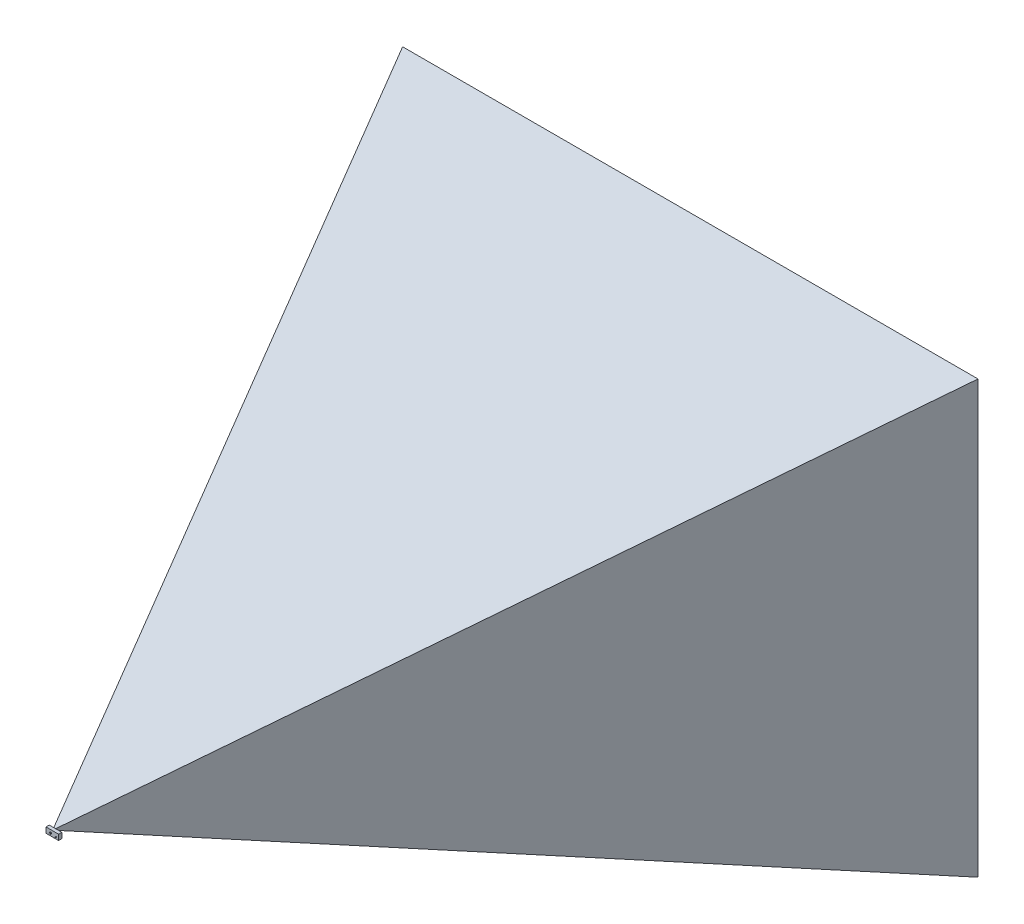
ISO-10303-21;
HEADER;
FILE_DESCRIPTION(('STEP AP214'),'2;1');
FILE_NAME('part.step','',(''),(''),'','','');
FILE_SCHEMA(('AUTOMOTIVE_DESIGN { 1 0 10303 214 1 1 1 1 }'));
ENDSEC;
DATA;
#1=APPLICATION_CONTEXT('core data for automotive mechanical design processes');
#2=APPLICATION_PROTOCOL_DEFINITION('international standard','automotive_design',2000,#1);
#3=PRODUCT_CONTEXT('',#1,'mechanical');
#4=PRODUCT('Part','Part','',(#3));
#5=PRODUCT_RELATED_PRODUCT_CATEGORY('part','',(#4));
#6=PRODUCT_DEFINITION_FORMATION('','',#4);
#7=PRODUCT_DEFINITION_CONTEXT('part definition',#1,'design');
#8=PRODUCT_DEFINITION('design','',#6,#7);
#9=PRODUCT_DEFINITION_SHAPE('','',#8);
#10=(LENGTH_UNIT() NAMED_UNIT(*) SI_UNIT(.MILLI.,.METRE.));
#11=(NAMED_UNIT(*) PLANE_ANGLE_UNIT() SI_UNIT($,.RADIAN.));
#12=(NAMED_UNIT(*) SI_UNIT($,.STERADIAN.) SOLID_ANGLE_UNIT());
#13=UNCERTAINTY_MEASURE_WITH_UNIT(LENGTH_MEASURE(1.E-05),#10,'distance_accuracy_value','');
#14=(GEOMETRIC_REPRESENTATION_CONTEXT(3) GLOBAL_UNCERTAINTY_ASSIGNED_CONTEXT((#13)) GLOBAL_UNIT_ASSIGNED_CONTEXT((#10,
#11,#12)) REPRESENTATION_CONTEXT('',''));
#15=CARTESIAN_POINT('',(0.,0.,0.));
#16=DIRECTION('',(0.,0.,1.));
#17=DIRECTION('',(1.,0.,0.));
#18=AXIS2_PLACEMENT_3D('',#15,#16,#17);
#19=CARTESIAN_POINT('',(15.8283664878638,0.,7.14095203174456));
#20=DIRECTION('',(-0.911529143769059,0.,-0.411235480059353));
#21=DIRECTION('',(-0.411235480059353,0.,0.911529143769059));
#22=AXIS2_PLACEMENT_3D('',#19,#20,#21);
#23=PLANE('',#22);
#24=DIRECTION('',(0.392969042868703,-0.294726782151528,-0.871040444083661));
#25=VECTOR('',#24,1.);
#26=CARTESIAN_POINT('',(19.05,15.5575,0.));
#27=LINE('',#26,#25);
#28=CARTESIAN_POINT('',(19.05,15.5575,0.));
#29=VERTEX_POINT('',#28);
#30=CARTESIAN_POINT('',(1644.65,-1203.6425,-3603.244));
#31=VERTEX_POINT('',#30);
#32=EDGE_CURVE('E81',#29,#31,#27,.T.);
#33=ORIENTED_EDGE('',*,*,#32,.T.);
#34=DIRECTION('',(0.,-1.,0.));
#35=VECTOR('',#34,1.);
#36=CARTESIAN_POINT('',(1644.65,1234.7575,-3603.244));
#37=LINE('',#36,#35);
#38=CARTESIAN_POINT('',(1644.65,1234.7575,-3603.244));
#39=VERTEX_POINT('',#38);
#40=EDGE_CURVE('E87',#39,#31,#37,.T.);
#41=ORIENTED_EDGE('',*,*,#40,.F.);
#42=DIRECTION('',(0.392969042868704,0.294726782151528,-0.871040444083661));
#43=VECTOR('',#42,1.);
#44=CARTESIAN_POINT('',(19.05,15.5575,0.));
#45=LINE('',#44,#43);
#46=EDGE_CURVE('E89',#29,#39,#45,.T.);
#47=ORIENTED_EDGE('',*,*,#46,.F.);
#48=EDGE_LOOP('',(#33,#41,#47));
#49=FACE_BOUND('',#48,.T.);
#50=ADVANCED_FACE('F47',(#49),#23,.F.);
#51=CARTESIAN_POINT('',(0.,13.9593162514934,4.72329888673117));
#52=DIRECTION('',(0.,-0.947244665918111,-0.32051137716107));
#53=DIRECTION('',(0.,0.32051137716107,-0.947244665918111));
#54=AXIS2_PLACEMENT_3D('',#51,#52,#53);
#55=PLANE('',#54);
#56=ORIENTED_EDGE('',*,*,#46,.T.);
#57=DIRECTION('',(1.,0.,0.));
#58=VECTOR('',#57,1.);
#59=CARTESIAN_POINT('',(1644.65,1234.7575,-3603.244));
#60=LINE('',#59,#58);
#61=CARTESIAN_POINT('',(-1606.55,1234.7575,-3603.244));
#62=VERTEX_POINT('',#61);
#63=EDGE_CURVE('E61',#62,#39,#60,.T.);
#64=ORIENTED_EDGE('',*,*,#63,.F.);
#65=DIRECTION('',(-0.392969042868704,0.294726782151528,-0.871040444083661));
#66=VECTOR('',#65,1.);
#67=CARTESIAN_POINT('',(19.05,15.5575,0.));
#68=LINE('',#67,#66);
#69=EDGE_CURVE('E50',#29,#62,#68,.T.);
#70=ORIENTED_EDGE('',*,*,#69,.F.);
#71=EDGE_LOOP('',(#56,#64,#70));
#72=FACE_BOUND('',#71,.T.);
#73=ADVANCED_FACE('F91',(#72),#55,.F.);
#74=CARTESIAN_POINT('',(0.,13.9593162514936,-4.72329888673123));
#75=DIRECTION('',(0.,0.947244665918111,-0.32051137716107));
#76=DIRECTION('',(0.,0.32051137716107,0.947244665918112));
#77=AXIS2_PLACEMENT_3D('',#74,#75,#76);
#78=PLANE('',#77);
#79=DIRECTION('',(-0.392969042868704,-0.294726782151528,-0.871040444083661));
#80=VECTOR('',#79,1.);
#81=CARTESIAN_POINT('',(19.05,15.5575,0.));
#82=LINE('',#81,#80);
#83=CARTESIAN_POINT('',(-1606.55,-1203.6425,-3603.244));
#84=VERTEX_POINT('',#83);
#85=EDGE_CURVE('E75',#29,#84,#82,.T.);
#86=ORIENTED_EDGE('',*,*,#85,.T.);
#87=DIRECTION('',(-1.,0.,0.));
#88=VECTOR('',#87,1.);
#89=CARTESIAN_POINT('',(1644.65,-1203.6425,-3603.244));
#90=LINE('',#89,#88);
#91=EDGE_CURVE('E78',#31,#84,#90,.T.);
#92=ORIENTED_EDGE('',*,*,#91,.F.);
#93=ORIENTED_EDGE('',*,*,#32,.F.);
#94=EDGE_LOOP('',(#86,#92,#93));
#95=FACE_BOUND('',#94,.T.);
#96=ADVANCED_FACE('F83',(#95),#78,.F.);
#97=CARTESIAN_POINT('',(15.8283664878636,0.,-7.14095203174447));
#98=DIRECTION('',(0.911529143769059,0.,-0.411235480059353));
#99=DIRECTION('',(-0.411235480059353,0.,-0.911529143769059));
#100=AXIS2_PLACEMENT_3D('',#97,#98,#99);
#101=PLANE('',#100);
#102=ORIENTED_EDGE('',*,*,#69,.T.);
#103=DIRECTION('',(0.,1.,0.));
#104=VECTOR('',#103,1.);
#105=CARTESIAN_POINT('',(-1606.55,1234.7575,-3603.244));
#106=LINE('',#105,#104);
#107=EDGE_CURVE('E12',#84,#62,#106,.T.);
#108=ORIENTED_EDGE('',*,*,#107,.F.);
#109=ORIENTED_EDGE('',*,*,#85,.F.);
#110=EDGE_LOOP('',(#102,#108,#109));
#111=FACE_BOUND('',#110,.T.);
#112=ADVANCED_FACE('F48',(#111),#101,.F.);
#113=OPEN_SHELL('',(#50,#73,#96,#112));
#114=SHELL_BASED_SURFACE_MODEL('B2',(#113));
#115=CARTESIAN_POINT('',(0.,0.,18.415));
#116=DIRECTION('',(0.,0.,-1.));
#117=DIRECTION('',(-1.,0.,0.));
#118=AXIS2_PLACEMENT_3D('',#115,#116,#117);
#119=PLANE('',#118);
#120=CARTESIAN_POINT('',(57.023,10.7949999541869,18.415));
#121=DIRECTION('',(0.,0.,-1.));
#122=DIRECTION('',(-1.,0.,0.));
#123=AXIS2_PLACEMENT_3D('',#120,#121,#122);
#124=CIRCLE('',#123,1.90500000000001);
#125=CARTESIAN_POINT('',(55.118,10.7949999541869,18.415));
#126=VERTEX_POINT('',#125);
#127=EDGE_CURVE('E45',#126,#126,#124,.F.);
#128=ORIENTED_EDGE('',*,*,#127,.F.);
#129=EDGE_LOOP('',(#128));
#130=FACE_BOUND('',#129,.T.);
#131=DIRECTION('',(0.,1.,0.));
#132=VECTOR('',#131,1.);
#133=CARTESIAN_POINT('',(0.,0.,18.415));
#134=LINE('',#133,#132);
#135=CARTESIAN_POINT('',(0.,0.,18.415));
#136=VERTEX_POINT('',#135);
#137=CARTESIAN_POINT('',(0.,31.115,18.415));
#138=VERTEX_POINT('',#137);
#139=EDGE_CURVE('E233',#136,#138,#134,.T.);
#140=ORIENTED_EDGE('',*,*,#139,.F.);
#141=DIRECTION('',(1.,0.,0.));
#142=VECTOR('',#141,1.);
#143=CARTESIAN_POINT('',(0.,0.,18.415));
#144=LINE('',#143,#142);
#145=CARTESIAN_POINT('',(70.993,0.,18.415));
#146=VERTEX_POINT('',#145);
#147=EDGE_CURVE('E242',#136,#146,#144,.T.);
#148=ORIENTED_EDGE('',*,*,#147,.T.);
#149=DIRECTION('',(0.,1.,0.));
#150=VECTOR('',#149,1.);
#151=CARTESIAN_POINT('',(70.993,0.,18.415));
#152=LINE('',#151,#150);
#153=CARTESIAN_POINT('',(70.993,31.115,18.415));
#154=VERTEX_POINT('',#153);
#155=EDGE_CURVE('E240',#146,#154,#152,.T.);
#156=ORIENTED_EDGE('',*,*,#155,.T.);
#157=DIRECTION('',(1.,0.,0.));
#158=VECTOR('',#157,1.);
#159=CARTESIAN_POINT('',(0.,31.115,18.415));
#160=LINE('',#159,#158);
#161=EDGE_CURVE('E236',#138,#154,#160,.T.);
#162=ORIENTED_EDGE('',*,*,#161,.F.);
#163=EDGE_LOOP('',(#140,#148,#156,#162));
#164=FACE_BOUND('',#163,.T.);
#165=DIRECTION('',(0.,1.,0.));
#166=VECTOR('',#165,1.);
#167=CARTESIAN_POINT('',(31.75,12.3825,18.415));
#168=LINE('',#167,#166);
#169=CARTESIAN_POINT('',(31.75,12.3825,18.415));
#170=VERTEX_POINT('',#169);
#171=CARTESIAN_POINT('',(31.75,18.7325,18.415));
#172=VERTEX_POINT('',#171);
#173=EDGE_CURVE('E223',#170,#172,#168,.T.);
#174=ORIENTED_EDGE('',*,*,#173,.F.);
#175=DIRECTION('',(1.,0.,0.));
#176=VECTOR('',#175,1.);
#177=CARTESIAN_POINT('',(24.13,12.3825,18.415));
#178=LINE('',#177,#176);
#179=CARTESIAN_POINT('',(24.13,12.3825,18.415));
#180=VERTEX_POINT('',#179);
#181=EDGE_CURVE('E220',#180,#170,#178,.T.);
#182=ORIENTED_EDGE('',*,*,#181,.F.);
#183=DIRECTION('',(0.,-1.,0.));
#184=VECTOR('',#183,1.);
#185=CARTESIAN_POINT('',(24.13,12.3825,18.415));
#186=LINE('',#185,#184);
#187=CARTESIAN_POINT('',(24.13,18.7325,18.415));
#188=VERTEX_POINT('',#187);
#189=EDGE_CURVE('E158',#188,#180,#186,.T.);
#190=ORIENTED_EDGE('',*,*,#189,.F.);
#191=DIRECTION('',(-1.,0.,0.));
#192=VECTOR('',#191,1.);
#193=CARTESIAN_POINT('',(24.13,18.7325,18.415));
#194=LINE('',#193,#192);
#195=EDGE_CURVE('E153',#172,#188,#194,.T.);
#196=ORIENTED_EDGE('',*,*,#195,.F.);
#197=EDGE_LOOP('',(#174,#182,#190,#196));
#198=FACE_BOUND('',#197,.T.);
#199=ADVANCED_FACE('F138',(#130,#164,#198),#119,.F.);
#200=CARTESIAN_POINT('',(0.,0.,18.415));
#201=DIRECTION('',(-1.,0.,0.));
#202=DIRECTION('',(0.,0.,1.));
#203=AXIS2_PLACEMENT_3D('',#200,#201,#202);
#204=PLANE('',#203);
#205=DIRECTION('',(0.,1.,0.));
#206=VECTOR('',#205,1.);
#207=CARTESIAN_POINT('',(0.,0.,0.));
#208=LINE('',#207,#206);
#209=CARTESIAN_POINT('',(0.,0.,0.));
#210=VERTEX_POINT('',#209);
#211=CARTESIAN_POINT('',(0.,31.115,0.));
#212=VERTEX_POINT('',#211);
#213=EDGE_CURVE('E224',#210,#212,#208,.T.);
#214=ORIENTED_EDGE('',*,*,#213,.F.);
#215=DIRECTION('',(0.,0.,-1.));
#216=VECTOR('',#215,1.);
#217=CARTESIAN_POINT('',(0.,0.,18.415));
#218=LINE('',#217,#216);
#219=EDGE_CURVE('E146',#136,#210,#218,.T.);
#220=ORIENTED_EDGE('',*,*,#219,.F.);
#221=ORIENTED_EDGE('',*,*,#139,.T.);
#222=DIRECTION('',(0.,0.,-1.));
#223=VECTOR('',#222,1.);
#224=CARTESIAN_POINT('',(0.,31.115,18.415));
#225=LINE('',#224,#223);
#226=EDGE_CURVE('E243',#138,#212,#225,.T.);
#227=ORIENTED_EDGE('',*,*,#226,.T.);
#228=EDGE_LOOP('',(#214,#220,#221,#227));
#229=FACE_BOUND('',#228,.T.);
#230=ADVANCED_FACE('F140',(#229),#204,.T.);
#231=CARTESIAN_POINT('',(0.,0.,18.415));
#232=DIRECTION('',(0.,1.,0.));
#233=DIRECTION('',(0.,0.,1.));
#234=AXIS2_PLACEMENT_3D('',#231,#232,#233);
#235=PLANE('',#234);
#236=DIRECTION('',(1.,0.,0.));
#237=VECTOR('',#236,1.);
#238=CARTESIAN_POINT('',(0.,0.,0.));
#239=LINE('',#238,#237);
#240=CARTESIAN_POINT('',(70.993,0.,0.));
#241=VERTEX_POINT('',#240);
#242=EDGE_CURVE('E237',#210,#241,#239,.T.);
#243=ORIENTED_EDGE('',*,*,#242,.T.);
#244=DIRECTION('',(0.,0.,-1.));
#245=VECTOR('',#244,1.);
#246=CARTESIAN_POINT('',(70.993,0.,18.415));
#247=LINE('',#246,#245);
#248=EDGE_CURVE('E252',#146,#241,#247,.T.);
#249=ORIENTED_EDGE('',*,*,#248,.F.);
#250=ORIENTED_EDGE('',*,*,#147,.F.);
#251=ORIENTED_EDGE('',*,*,#219,.T.);
#252=EDGE_LOOP('',(#243,#249,#250,#251));
#253=FACE_BOUND('',#252,.T.);
#254=ADVANCED_FACE('F270',(#253),#235,.F.);
#255=CARTESIAN_POINT('',(70.993,0.,18.415));
#256=DIRECTION('',(-1.,0.,0.));
#257=DIRECTION('',(0.,0.,1.));
#258=AXIS2_PLACEMENT_3D('',#255,#256,#257);
#259=PLANE('',#258);
#260=DIRECTION('',(0.,1.,0.));
#261=VECTOR('',#260,1.);
#262=CARTESIAN_POINT('',(70.993,0.,0.));
#263=LINE('',#262,#261);
#264=CARTESIAN_POINT('',(70.993,31.115,0.));
#265=VERTEX_POINT('',#264);
#266=EDGE_CURVE('E247',#241,#265,#263,.T.);
#267=ORIENTED_EDGE('',*,*,#266,.T.);
#268=DIRECTION('',(0.,0.,-1.));
#269=VECTOR('',#268,1.);
#270=CARTESIAN_POINT('',(70.993,31.115,18.415));
#271=LINE('',#270,#269);
#272=EDGE_CURVE('E255',#154,#265,#271,.T.);
#273=ORIENTED_EDGE('',*,*,#272,.F.);
#274=ORIENTED_EDGE('',*,*,#155,.F.);
#275=ORIENTED_EDGE('',*,*,#248,.T.);
#276=EDGE_LOOP('',(#267,#273,#274,#275));
#277=FACE_BOUND('',#276,.T.);
#278=ADVANCED_FACE('F274',(#277),#259,.F.);
#279=CARTESIAN_POINT('',(0.,31.115,18.415));
#280=DIRECTION('',(0.,1.,0.));
#281=DIRECTION('',(0.,0.,1.));
#282=AXIS2_PLACEMENT_3D('',#279,#280,#281);
#283=PLANE('',#282);
#284=DIRECTION('',(1.,0.,0.));
#285=VECTOR('',#284,1.);
#286=CARTESIAN_POINT('',(0.,31.115,0.));
#287=LINE('',#286,#285);
#288=EDGE_CURVE('E227',#212,#265,#287,.T.);
#289=ORIENTED_EDGE('',*,*,#288,.F.);
#290=ORIENTED_EDGE('',*,*,#226,.F.);
#291=ORIENTED_EDGE('',*,*,#161,.T.);
#292=ORIENTED_EDGE('',*,*,#272,.T.);
#293=EDGE_LOOP('',(#289,#290,#291,#292));
#294=FACE_BOUND('',#293,.T.);
#295=ADVANCED_FACE('F262',(#294),#283,.T.);
#296=CARTESIAN_POINT('',(0.,0.,0.));
#297=DIRECTION('',(0.,0.,-1.));
#298=DIRECTION('',(-1.,0.,0.));
#299=AXIS2_PLACEMENT_3D('',#296,#297,#298);
#300=PLANE('',#299);
#301=CARTESIAN_POINT('',(19.05,15.5575,0.));
#302=DIRECTION('',(0.,0.,-1.));
#303=DIRECTION('',(-1.,0.,0.));
#304=AXIS2_PLACEMENT_3D('',#301,#302,#303);
#305=CIRCLE('',#304,5.715);
#306=CARTESIAN_POINT('',(13.335,15.5575,0.));
#307=VERTEX_POINT('',#306);
#308=EDGE_CURVE('E297',#307,#307,#305,.T.);
#309=ORIENTED_EDGE('',*,*,#308,.F.);
#310=EDGE_LOOP('',(#309));
#311=FACE_BOUND('',#310,.T.);
#312=ORIENTED_EDGE('',*,*,#213,.T.);
#313=ORIENTED_EDGE('',*,*,#288,.T.);
#314=ORIENTED_EDGE('',*,*,#266,.F.);
#315=ORIENTED_EDGE('',*,*,#242,.F.);
#316=EDGE_LOOP('',(#312,#313,#314,#315));
#317=FACE_BOUND('',#316,.T.);
#318=ADVANCED_FACE('F267',(#311,#317),#300,.T.);
#319=CARTESIAN_POINT('',(31.75,12.3825,24.765));
#320=DIRECTION('',(-1.,0.,0.));
#321=DIRECTION('',(0.,0.,1.));
#322=AXIS2_PLACEMENT_3D('',#319,#320,#321);
#323=PLANE('',#322);
#324=ORIENTED_EDGE('',*,*,#173,.T.);
#325=DIRECTION('',(0.,0.,-1.));
#326=VECTOR('',#325,1.);
#327=CARTESIAN_POINT('',(31.75,18.7325,24.765));
#328=LINE('',#327,#326);
#329=CARTESIAN_POINT('',(31.75,18.7325,24.765));
#330=VERTEX_POINT('',#329);
#331=EDGE_CURVE('E204',#330,#172,#328,.T.);
#332=ORIENTED_EDGE('',*,*,#331,.F.);
#333=DIRECTION('',(0.,1.,0.));
#334=VECTOR('',#333,1.);
#335=CARTESIAN_POINT('',(31.75,12.3825,24.765));
#336=LINE('',#335,#334);
#337=CARTESIAN_POINT('',(31.75,12.3825,24.765));
#338=VERTEX_POINT('',#337);
#339=EDGE_CURVE('E211',#338,#330,#336,.T.);
#340=ORIENTED_EDGE('',*,*,#339,.F.);
#341=DIRECTION('',(0.,0.,-1.));
#342=VECTOR('',#341,1.);
#343=CARTESIAN_POINT('',(31.75,12.3825,24.765));
#344=LINE('',#343,#342);
#345=EDGE_CURVE('E285',#338,#170,#344,.T.);
#346=ORIENTED_EDGE('',*,*,#345,.T.);
#347=EDGE_LOOP('',(#324,#332,#340,#346));
#348=FACE_BOUND('',#347,.T.);
#349=ADVANCED_FACE('F222',(#348),#323,.F.);
#350=CARTESIAN_POINT('',(24.13,18.7325,24.765));
#351=DIRECTION('',(0.,-1.,0.));
#352=DIRECTION('',(0.,0.,-1.));
#353=AXIS2_PLACEMENT_3D('',#350,#351,#352);
#354=PLANE('',#353);
#355=ORIENTED_EDGE('',*,*,#195,.T.);
#356=DIRECTION('',(0.,0.,-1.));
#357=VECTOR('',#356,1.);
#358=CARTESIAN_POINT('',(24.13,18.7325,24.765));
#359=LINE('',#358,#357);
#360=CARTESIAN_POINT('',(24.13,18.7325,24.765));
#361=VERTEX_POINT('',#360);
#362=EDGE_CURVE('E207',#361,#188,#359,.T.);
#363=ORIENTED_EDGE('',*,*,#362,.F.);
#364=DIRECTION('',(-1.,0.,0.));
#365=VECTOR('',#364,1.);
#366=CARTESIAN_POINT('',(24.13,18.7325,24.765));
#367=LINE('',#366,#365);
#368=EDGE_CURVE('E200',#330,#361,#367,.T.);
#369=ORIENTED_EDGE('',*,*,#368,.F.);
#370=ORIENTED_EDGE('',*,*,#331,.T.);
#371=EDGE_LOOP('',(#355,#363,#369,#370));
#372=FACE_BOUND('',#371,.T.);
#373=ADVANCED_FACE('F202',(#372),#354,.F.);
#374=CARTESIAN_POINT('',(24.13,12.3825,24.765));
#375=DIRECTION('',(1.,0.,0.));
#376=DIRECTION('',(0.,0.,-1.));
#377=AXIS2_PLACEMENT_3D('',#374,#375,#376);
#378=PLANE('',#377);
#379=ORIENTED_EDGE('',*,*,#189,.T.);
#380=DIRECTION('',(0.,0.,-1.));
#381=VECTOR('',#380,1.);
#382=CARTESIAN_POINT('',(24.13,12.3825,24.765));
#383=LINE('',#382,#381);
#384=CARTESIAN_POINT('',(24.13,12.3825,24.765));
#385=VERTEX_POINT('',#384);
#386=EDGE_CURVE('E229',#385,#180,#383,.T.);
#387=ORIENTED_EDGE('',*,*,#386,.F.);
#388=DIRECTION('',(0.,-1.,0.));
#389=VECTOR('',#388,1.);
#390=CARTESIAN_POINT('',(24.13,12.3825,24.765));
#391=LINE('',#390,#389);
#392=EDGE_CURVE('E210',#361,#385,#391,.T.);
#393=ORIENTED_EDGE('',*,*,#392,.F.);
#394=ORIENTED_EDGE('',*,*,#362,.T.);
#395=EDGE_LOOP('',(#379,#387,#393,#394));
#396=FACE_BOUND('',#395,.T.);
#397=ADVANCED_FACE('F354',(#396),#378,.F.);
#398=CARTESIAN_POINT('',(24.13,12.3825,24.765));
#399=DIRECTION('',(0.,1.,0.));
#400=DIRECTION('',(0.,0.,1.));
#401=AXIS2_PLACEMENT_3D('',#398,#399,#400);
#402=PLANE('',#401);
#403=ORIENTED_EDGE('',*,*,#181,.T.);
#404=ORIENTED_EDGE('',*,*,#345,.F.);
#405=DIRECTION('',(1.,0.,0.));
#406=VECTOR('',#405,1.);
#407=CARTESIAN_POINT('',(24.13,12.3825,24.765));
#408=LINE('',#407,#406);
#409=EDGE_CURVE('E216',#385,#338,#408,.T.);
#410=ORIENTED_EDGE('',*,*,#409,.F.);
#411=ORIENTED_EDGE('',*,*,#386,.T.);
#412=EDGE_LOOP('',(#403,#404,#410,#411));
#413=FACE_BOUND('',#412,.T.);
#414=ADVANCED_FACE('F284',(#413),#402,.F.);
#415=CARTESIAN_POINT('',(0.,0.,24.765));
#416=DIRECTION('',(0.,0.,-1.));
#417=DIRECTION('',(-1.,0.,0.));
#418=AXIS2_PLACEMENT_3D('',#415,#416,#417);
#419=PLANE('',#418);
#420=ORIENTED_EDGE('',*,*,#339,.T.);
#421=ORIENTED_EDGE('',*,*,#368,.T.);
#422=ORIENTED_EDGE('',*,*,#392,.T.);
#423=ORIENTED_EDGE('',*,*,#409,.T.);
#424=EDGE_LOOP('',(#420,#421,#422,#423));
#425=FACE_BOUND('',#424,.T.);
#426=ADVANCED_FACE('F214',(#425),#419,.F.);
#427=CARTESIAN_POINT('',(57.023,10.7949999541869,24.765));
#428=DIRECTION('',(0.,0.,-1.));
#429=DIRECTION('',(-1.,0.,0.));
#430=AXIS2_PLACEMENT_3D('',#427,#428,#429);
#431=CYLINDRICAL_SURFACE('',#430,1.90500000000001);
#432=CARTESIAN_POINT('',(57.023,10.7949999541869,24.765));
#433=DIRECTION('',(0.,0.,1.));
#434=DIRECTION('',(1.,0.,0.));
#435=AXIS2_PLACEMENT_3D('',#432,#433,#434);
#436=CIRCLE('',#435,1.90500000000001);
#437=CARTESIAN_POINT('',(58.928,10.7949999541869,24.765));
#438=VERTEX_POINT('',#437);
#439=EDGE_CURVE('E280',#438,#438,#436,.T.);
#440=ORIENTED_EDGE('',*,*,#439,.F.);
#441=EDGE_LOOP('',(#440));
#442=FACE_BOUND('',#441,.T.);
#443=ORIENTED_EDGE('',*,*,#127,.T.);
#444=EDGE_LOOP('',(#443));
#445=FACE_BOUND('',#444,.T.);
#446=ADVANCED_FACE('F380',(#442,#445),#431,.T.);
#447=CARTESIAN_POINT('',(57.023,10.7949999541869,24.765));
#448=DIRECTION('',(0.,0.,1.));
#449=DIRECTION('',(1.,0.,0.));
#450=AXIS2_PLACEMENT_3D('',#447,#448,#449);
#451=PLANE('',#450);
#452=ORIENTED_EDGE('',*,*,#439,.T.);
#453=EDGE_LOOP('',(#452));
#454=FACE_BOUND('',#453,.T.);
#455=ADVANCED_FACE('F308',(#454),#451,.T.);
#456=CARTESIAN_POINT('',(19.05,15.5575,2.54));
#457=DIRECTION('',(0.,0.,-1.));
#458=DIRECTION('',(-1.,0.,0.));
#459=AXIS2_PLACEMENT_3D('',#456,#457,#458);
#460=CYLINDRICAL_SURFACE('',#459,5.715);
#461=CARTESIAN_POINT('',(19.05,15.5575,2.54));
#462=DIRECTION('',(0.,0.,-1.));
#463=DIRECTION('',(-1.,0.,0.));
#464=AXIS2_PLACEMENT_3D('',#461,#462,#463);
#465=CIRCLE('',#464,5.715);
#466=CARTESIAN_POINT('',(13.335,15.5575,2.54));
#467=VERTEX_POINT('',#466);
#468=EDGE_CURVE('E296',#467,#467,#465,.T.);
#469=ORIENTED_EDGE('',*,*,#468,.F.);
#470=EDGE_LOOP('',(#469));
#471=FACE_BOUND('',#470,.T.);
#472=ORIENTED_EDGE('',*,*,#308,.T.);
#473=EDGE_LOOP('',(#472));
#474=FACE_BOUND('',#473,.T.);
#475=ADVANCED_FACE('F305',(#471,#474),#460,.F.);
#476=CARTESIAN_POINT('',(19.05,15.5575,2.54));
#477=DIRECTION('',(0.,0.,-1.));
#478=DIRECTION('',(-1.,0.,0.));
#479=AXIS2_PLACEMENT_3D('',#476,#477,#478);
#480=PLANE('',#479);
#481=ORIENTED_EDGE('',*,*,#468,.T.);
#482=EDGE_LOOP('',(#481));
#483=FACE_BOUND('',#482,.T.);
#484=ADVANCED_FACE('F303',(#483),#480,.T.);
#485=CLOSED_SHELL('',(#199,#230,#254,#278,#295,#318,#349,#373,#397,#414,#426,#446,#455,#475,#484));
#486=MANIFOLD_SOLID_BREP('B6',#485);
#487=ADVANCED_BREP_SHAPE_REPRESENTATION('',(#18,#486),#14);
#488=MANIFOLD_SURFACE_SHAPE_REPRESENTATION('',(#18,#114),#14);
#489=SHAPE_REPRESENTATION('',(#18),#14);
#490=SHAPE_DEFINITION_REPRESENTATION(#9,#489);
#491=SHAPE_REPRESENTATION_RELATIONSHIP('','',#489,#487);
#492=SHAPE_REPRESENTATION_RELATIONSHIP('','',#489,#488);
ENDSEC;
END-ISO-10303-21;
